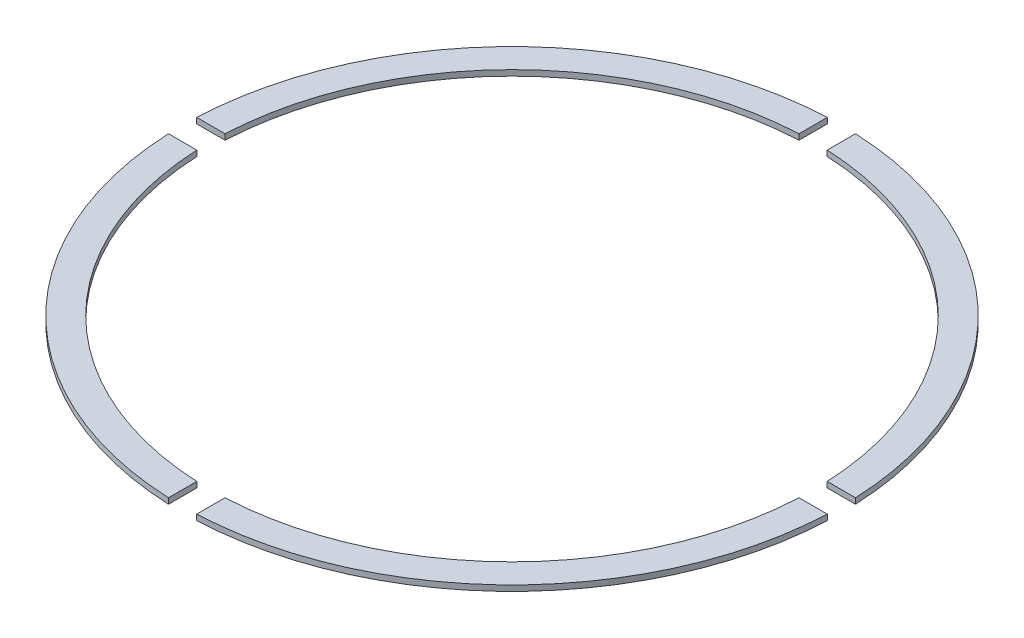
ISO-10303-21;
HEADER;
FILE_DESCRIPTION(('STEP AP214'),'2;1');
FILE_NAME('part.step','',(''),(''),'','','');
FILE_SCHEMA(('AUTOMOTIVE_DESIGN { 1 0 10303 214 1 1 1 1 }'));
ENDSEC;
DATA;
#1=APPLICATION_CONTEXT('core data for automotive mechanical design processes');
#2=APPLICATION_PROTOCOL_DEFINITION('international standard','automotive_design',2000,#1);
#3=PRODUCT_CONTEXT('',#1,'mechanical');
#4=PRODUCT('Part','Part','',(#3));
#5=PRODUCT_RELATED_PRODUCT_CATEGORY('part','',(#4));
#6=PRODUCT_DEFINITION_FORMATION('','',#4);
#7=PRODUCT_DEFINITION_CONTEXT('part definition',#1,'design');
#8=PRODUCT_DEFINITION('design','',#6,#7);
#9=PRODUCT_DEFINITION_SHAPE('','',#8);
#10=(LENGTH_UNIT() NAMED_UNIT(*) SI_UNIT(.MILLI.,.METRE.));
#11=(NAMED_UNIT(*) PLANE_ANGLE_UNIT() SI_UNIT($,.RADIAN.));
#12=(NAMED_UNIT(*) SI_UNIT($,.STERADIAN.) SOLID_ANGLE_UNIT());
#13=UNCERTAINTY_MEASURE_WITH_UNIT(LENGTH_MEASURE(1.E-05),#10,'distance_accuracy_value','');
#14=(GEOMETRIC_REPRESENTATION_CONTEXT(3) GLOBAL_UNCERTAINTY_ASSIGNED_CONTEXT((#13)) GLOBAL_UNIT_ASSIGNED_CONTEXT((#10,
#11,#12)) REPRESENTATION_CONTEXT('',''));
#15=CARTESIAN_POINT('',(0.,0.,0.));
#16=DIRECTION('',(0.,0.,1.));
#17=DIRECTION('',(1.,0.,0.));
#18=AXIS2_PLACEMENT_3D('',#15,#16,#17);
#19=CARTESIAN_POINT('',(0.,1.5,0.));
#20=DIRECTION('',(0.,1.,0.));
#21=DIRECTION('',(0.,0.,1.));
#22=AXIS2_PLACEMENT_3D('',#19,#20,#21);
#23=PLANE('',#22);
#24=DIRECTION('',(0.,0.,-1.));
#25=VECTOR('',#24,1.);
#26=CARTESIAN_POINT('',(7.49999999999936,1.5,-183.804563233899));
#27=LINE('',#26,#25);
#28=CARTESIAN_POINT('',(7.49999999999944,1.5,-159.824122084246));
#29=VERTEX_POINT('',#28);
#30=CARTESIAN_POINT('',(7.49999999999939,1.5,-174.839211849059));
#31=VERTEX_POINT('',#30);
#32=EDGE_CURVE('E12',#29,#31,#27,.T.);
#33=ORIENTED_EDGE('',*,*,#32,.F.);
#34=CARTESIAN_POINT('',(0.,1.5,0.));
#35=DIRECTION('',(0.,1.,0.));
#36=DIRECTION('',(0.,0.,1.));
#37=AXIS2_PLACEMENT_3D('',#34,#35,#36);
#38=CIRCLE('',#37,160.);
#39=CARTESIAN_POINT('',(159.824122084246,1.5,-7.5));
#40=VERTEX_POINT('',#39);
#41=EDGE_CURVE('E48',#40,#29,#38,.T.);
#42=ORIENTED_EDGE('',*,*,#41,.F.);
#43=DIRECTION('',(-1.,0.,0.));
#44=VECTOR('',#43,1.);
#45=CARTESIAN_POINT('',(183.804563233898,1.5,-7.5));
#46=LINE('',#45,#44);
#47=CARTESIAN_POINT('',(174.839211849059,1.5,-7.5));
#48=VERTEX_POINT('',#47);
#49=EDGE_CURVE('E97',#48,#40,#46,.T.);
#50=ORIENTED_EDGE('',*,*,#49,.F.);
#51=CARTESIAN_POINT('',(0.,1.5,0.));
#52=DIRECTION('',(0.,1.,0.));
#53=DIRECTION('',(0.,0.,1.));
#54=AXIS2_PLACEMENT_3D('',#51,#52,#53);
#55=CIRCLE('',#54,175.);
#56=EDGE_CURVE('E94',#48,#31,#55,.T.);
#57=ORIENTED_EDGE('',*,*,#56,.T.);
#58=EDGE_LOOP('',(#33,#42,#50,#57));
#59=FACE_BOUND('',#58,.T.);
#60=ADVANCED_FACE('F45',(#59),#23,.T.);
#61=CARTESIAN_POINT('',(0.,-1.5,0.));
#62=DIRECTION('',(0.,1.,0.));
#63=DIRECTION('',(0.,0.,1.));
#64=AXIS2_PLACEMENT_3D('',#61,#62,#63);
#65=PLANE('',#64);
#66=CARTESIAN_POINT('',(0.,-1.5,0.));
#67=DIRECTION('',(0.,1.,0.));
#68=DIRECTION('',(0.,0.,1.));
#69=AXIS2_PLACEMENT_3D('',#66,#67,#68);
#70=CIRCLE('',#69,160.);
#71=CARTESIAN_POINT('',(159.824122084246,-1.5,-7.5));
#72=VERTEX_POINT('',#71);
#73=CARTESIAN_POINT('',(7.49999999999944,-1.5,-159.824122084246));
#74=VERTEX_POINT('',#73);
#75=EDGE_CURVE('E112',#72,#74,#70,.T.);
#76=ORIENTED_EDGE('',*,*,#75,.T.);
#77=DIRECTION('',(0.,0.,-1.));
#78=VECTOR('',#77,1.);
#79=CARTESIAN_POINT('',(7.49999999999936,-1.5,-183.804563233899));
#80=LINE('',#79,#78);
#81=CARTESIAN_POINT('',(7.49999999999939,-1.5,-174.839211849059));
#82=VERTEX_POINT('',#81);
#83=EDGE_CURVE('E79',#74,#82,#80,.T.);
#84=ORIENTED_EDGE('',*,*,#83,.T.);
#85=CARTESIAN_POINT('',(0.,-1.5,0.));
#86=DIRECTION('',(0.,1.,0.));
#87=DIRECTION('',(0.,0.,1.));
#88=AXIS2_PLACEMENT_3D('',#85,#86,#87);
#89=CIRCLE('',#88,175.);
#90=CARTESIAN_POINT('',(174.839211849059,-1.5,-7.5));
#91=VERTEX_POINT('',#90);
#92=EDGE_CURVE('E105',#91,#82,#89,.T.);
#93=ORIENTED_EDGE('',*,*,#92,.F.);
#94=DIRECTION('',(-1.,0.,0.));
#95=VECTOR('',#94,1.);
#96=CARTESIAN_POINT('',(183.804563233898,-1.5,-7.5));
#97=LINE('',#96,#95);
#98=EDGE_CURVE('E109',#91,#72,#97,.T.);
#99=ORIENTED_EDGE('',*,*,#98,.T.);
#100=EDGE_LOOP('',(#76,#84,#93,#99));
#101=FACE_BOUND('',#100,.T.);
#102=ADVANCED_FACE('F117',(#101),#65,.F.);
#103=CARTESIAN_POINT('',(0.,1.5,0.));
#104=DIRECTION('',(0.,-1.,0.));
#105=DIRECTION('',(0.,0.,-1.));
#106=AXIS2_PLACEMENT_3D('',#103,#104,#105);
#107=CYLINDRICAL_SURFACE('',#106,175.);
#108=ORIENTED_EDGE('',*,*,#92,.T.);
#109=DIRECTION('',(0.,-1.,0.));
#110=VECTOR('',#109,1.);
#111=CARTESIAN_POINT('',(7.49999999999939,1.5,-174.839211849059));
#112=LINE('',#111,#110);
#113=EDGE_CURVE('E62',#82,#31,#112,.F.);
#114=ORIENTED_EDGE('',*,*,#113,.T.);
#115=ORIENTED_EDGE('',*,*,#56,.F.);
#116=DIRECTION('',(0.,-1.,0.));
#117=VECTOR('',#116,1.);
#118=CARTESIAN_POINT('',(174.839211849059,1.5,-7.5));
#119=LINE('',#118,#117);
#120=EDGE_CURVE('E98',#48,#91,#119,.T.);
#121=ORIENTED_EDGE('',*,*,#120,.T.);
#122=EDGE_LOOP('',(#108,#114,#115,#121));
#123=FACE_BOUND('',#122,.T.);
#124=ADVANCED_FACE('F115',(#123),#107,.T.);
#125=CARTESIAN_POINT('',(0.,1.5,0.));
#126=DIRECTION('',(0.,-1.,0.));
#127=DIRECTION('',(0.,0.,-1.));
#128=AXIS2_PLACEMENT_3D('',#125,#126,#127);
#129=CYLINDRICAL_SURFACE('',#128,160.);
#130=DIRECTION('',(0.,-1.,0.));
#131=VECTOR('',#130,1.);
#132=CARTESIAN_POINT('',(7.49999999999944,1.5,-159.824122084246));
#133=LINE('',#132,#131);
#134=EDGE_CURVE('E54',#74,#29,#133,.F.);
#135=ORIENTED_EDGE('',*,*,#134,.F.);
#136=ORIENTED_EDGE('',*,*,#75,.F.);
#137=DIRECTION('',(0.,-1.,0.));
#138=VECTOR('',#137,1.);
#139=CARTESIAN_POINT('',(159.824122084246,1.5,-7.5));
#140=LINE('',#139,#138);
#141=EDGE_CURVE('E87',#40,#72,#140,.T.);
#142=ORIENTED_EDGE('',*,*,#141,.F.);
#143=ORIENTED_EDGE('',*,*,#41,.T.);
#144=EDGE_LOOP('',(#135,#136,#142,#143));
#145=FACE_BOUND('',#144,.T.);
#146=ADVANCED_FACE('F96',(#145),#129,.F.);
#147=CARTESIAN_POINT('',(183.804563233898,-1.5,-7.5));
#148=DIRECTION('',(0.,0.,-1.));
#149=DIRECTION('',(-1.,0.,0.));
#150=AXIS2_PLACEMENT_3D('',#147,#148,#149);
#151=PLANE('',#150);
#152=ORIENTED_EDGE('',*,*,#49,.T.);
#153=ORIENTED_EDGE('',*,*,#141,.T.);
#154=ORIENTED_EDGE('',*,*,#98,.F.);
#155=ORIENTED_EDGE('',*,*,#120,.F.);
#156=EDGE_LOOP('',(#152,#153,#154,#155));
#157=FACE_BOUND('',#156,.T.);
#158=ADVANCED_FACE('F119',(#157),#151,.F.);
#159=CARTESIAN_POINT('',(7.49999999999936,-1.5,-183.804563233899));
#160=DIRECTION('',(1.,0.,0.));
#161=DIRECTION('',(0.,0.,-1.));
#162=AXIS2_PLACEMENT_3D('',#159,#160,#161);
#163=PLANE('',#162);
#164=ORIENTED_EDGE('',*,*,#83,.F.);
#165=ORIENTED_EDGE('',*,*,#134,.T.);
#166=ORIENTED_EDGE('',*,*,#32,.T.);
#167=ORIENTED_EDGE('',*,*,#113,.F.);
#168=EDGE_LOOP('',(#164,#165,#166,#167));
#169=FACE_BOUND('',#168,.T.);
#170=ADVANCED_FACE('F82',(#169),#163,.F.);
#171=CLOSED_SHELL('',(#60,#102,#124,#146,#158,#170));
#172=MANIFOLD_SOLID_BREP('B2',#171);
#173=CARTESIAN_POINT('',(0.,1.5,0.));
#174=DIRECTION('',(0.,-1.,0.));
#175=DIRECTION('',(0.,0.,-1.));
#176=AXIS2_PLACEMENT_3D('',#173,#174,#175);
#177=CYLINDRICAL_SURFACE('',#176,160.);
#178=DIRECTION('',(0.,-1.,0.));
#179=VECTOR('',#178,1.);
#180=CARTESIAN_POINT('',(-159.824122084246,1.5,7.5));
#181=LINE('',#180,#179);
#182=CARTESIAN_POINT('',(-159.824122084246,1.5,7.5));
#183=VERTEX_POINT('',#182);
#184=CARTESIAN_POINT('',(-159.824122084246,-1.5,7.5));
#185=VERTEX_POINT('',#184);
#186=EDGE_CURVE('E43',#183,#185,#181,.T.);
#187=ORIENTED_EDGE('',*,*,#186,.F.);
#188=CARTESIAN_POINT('',(0.,1.5,0.));
#189=DIRECTION('',(0.,1.,0.));
#190=DIRECTION('',(0.,0.,1.));
#191=AXIS2_PLACEMENT_3D('',#188,#189,#190);
#192=CIRCLE('',#191,160.);
#193=CARTESIAN_POINT('',(-7.49999999999833,1.5,159.824122084246));
#194=VERTEX_POINT('',#193);
#195=EDGE_CURVE('E182',#183,#194,#192,.T.);
#196=ORIENTED_EDGE('',*,*,#195,.T.);
#197=DIRECTION('',(0.,-1.,0.));
#198=VECTOR('',#197,1.);
#199=CARTESIAN_POINT('',(-7.49999999999833,1.5,159.824122084246));
#200=LINE('',#199,#198);
#201=CARTESIAN_POINT('',(-7.49999999999833,-1.5,159.824122084246));
#202=VERTEX_POINT('',#201);
#203=EDGE_CURVE('E216',#202,#194,#200,.F.);
#204=ORIENTED_EDGE('',*,*,#203,.F.);
#205=CARTESIAN_POINT('',(0.,-1.5,0.));
#206=DIRECTION('',(0.,1.,0.));
#207=DIRECTION('',(0.,0.,1.));
#208=AXIS2_PLACEMENT_3D('',#205,#206,#207);
#209=CIRCLE('',#208,160.);
#210=EDGE_CURVE('E233',#185,#202,#209,.T.);
#211=ORIENTED_EDGE('',*,*,#210,.F.);
#212=EDGE_LOOP('',(#187,#196,#204,#211));
#213=FACE_BOUND('',#212,.T.);
#214=ADVANCED_FACE('F178',(#213),#177,.F.);
#215=CARTESIAN_POINT('',(0.,1.5,0.));
#216=DIRECTION('',(0.,-1.,0.));
#217=DIRECTION('',(0.,0.,-1.));
#218=AXIS2_PLACEMENT_3D('',#215,#216,#217);
#219=CYLINDRICAL_SURFACE('',#218,175.);
#220=CARTESIAN_POINT('',(0.,1.5,0.));
#221=DIRECTION('',(0.,1.,0.));
#222=DIRECTION('',(0.,0.,1.));
#223=AXIS2_PLACEMENT_3D('',#220,#221,#222);
#224=CIRCLE('',#223,175.);
#225=CARTESIAN_POINT('',(-174.839211849059,1.5,7.5));
#226=VERTEX_POINT('',#225);
#227=CARTESIAN_POINT('',(-7.49999999999817,1.5,174.839211849059));
#228=VERTEX_POINT('',#227);
#229=EDGE_CURVE('E239',#226,#228,#224,.T.);
#230=ORIENTED_EDGE('',*,*,#229,.F.);
#231=DIRECTION('',(0.,-1.,0.));
#232=VECTOR('',#231,1.);
#233=CARTESIAN_POINT('',(-174.839211849059,1.5,7.5));
#234=LINE('',#233,#232);
#235=CARTESIAN_POINT('',(-174.839211849059,-1.5,7.5));
#236=VERTEX_POINT('',#235);
#237=EDGE_CURVE('E197',#226,#236,#234,.T.);
#238=ORIENTED_EDGE('',*,*,#237,.T.);
#239=CARTESIAN_POINT('',(0.,-1.5,0.));
#240=DIRECTION('',(0.,1.,0.));
#241=DIRECTION('',(0.,0.,1.));
#242=AXIS2_PLACEMENT_3D('',#239,#240,#241);
#243=CIRCLE('',#242,175.);
#244=CARTESIAN_POINT('',(-7.49999999999817,-1.5,174.839211849059));
#245=VERTEX_POINT('',#244);
#246=EDGE_CURVE('E235',#236,#245,#243,.T.);
#247=ORIENTED_EDGE('',*,*,#246,.T.);
#248=DIRECTION('',(0.,-1.,0.));
#249=VECTOR('',#248,1.);
#250=CARTESIAN_POINT('',(-7.49999999999817,1.5,174.839211849059));
#251=LINE('',#250,#249);
#252=EDGE_CURVE('E236',#245,#228,#251,.F.);
#253=ORIENTED_EDGE('',*,*,#252,.T.);
#254=EDGE_LOOP('',(#230,#238,#247,#253));
#255=FACE_BOUND('',#254,.T.);
#256=ADVANCED_FACE('F251',(#255),#219,.T.);
#257=CARTESIAN_POINT('',(0.,-1.5,0.));
#258=DIRECTION('',(0.,1.,0.));
#259=DIRECTION('',(0.,0.,1.));
#260=AXIS2_PLACEMENT_3D('',#257,#258,#259);
#261=PLANE('',#260);
#262=ORIENTED_EDGE('',*,*,#246,.F.);
#263=DIRECTION('',(1.,0.,0.));
#264=VECTOR('',#263,1.);
#265=CARTESIAN_POINT('',(-183.804563233898,-1.5,7.5));
#266=LINE('',#265,#264);
#267=EDGE_CURVE('E224',#236,#185,#266,.T.);
#268=ORIENTED_EDGE('',*,*,#267,.T.);
#269=ORIENTED_EDGE('',*,*,#210,.T.);
#270=DIRECTION('',(0.,0.,1.));
#271=VECTOR('',#270,1.);
#272=CARTESIAN_POINT('',(-7.49999999999807,-1.5,183.804563233899));
#273=LINE('',#272,#271);
#274=EDGE_CURVE('E219',#202,#245,#273,.T.);
#275=ORIENTED_EDGE('',*,*,#274,.T.);
#276=EDGE_LOOP('',(#262,#268,#269,#275));
#277=FACE_BOUND('',#276,.T.);
#278=ADVANCED_FACE('F232',(#277),#261,.F.);
#279=CARTESIAN_POINT('',(0.,1.5,0.));
#280=DIRECTION('',(0.,1.,0.));
#281=DIRECTION('',(0.,0.,1.));
#282=AXIS2_PLACEMENT_3D('',#279,#280,#281);
#283=PLANE('',#282);
#284=DIRECTION('',(1.,0.,0.));
#285=VECTOR('',#284,1.);
#286=CARTESIAN_POINT('',(-183.804563233898,1.5,7.5));
#287=LINE('',#286,#285);
#288=EDGE_CURVE('E188',#226,#183,#287,.T.);
#289=ORIENTED_EDGE('',*,*,#288,.F.);
#290=ORIENTED_EDGE('',*,*,#229,.T.);
#291=DIRECTION('',(0.,0.,1.));
#292=VECTOR('',#291,1.);
#293=CARTESIAN_POINT('',(-7.49999999999807,1.5,183.804563233899));
#294=LINE('',#293,#292);
#295=EDGE_CURVE('E211',#194,#228,#294,.T.);
#296=ORIENTED_EDGE('',*,*,#295,.F.);
#297=ORIENTED_EDGE('',*,*,#195,.F.);
#298=EDGE_LOOP('',(#289,#290,#296,#297));
#299=FACE_BOUND('',#298,.T.);
#300=ADVANCED_FACE('F180',(#299),#283,.T.);
#301=CARTESIAN_POINT('',(-7.49999999999807,-1.5,183.804563233899));
#302=DIRECTION('',(-1.,0.,0.));
#303=DIRECTION('',(0.,0.,1.));
#304=AXIS2_PLACEMENT_3D('',#301,#302,#303);
#305=PLANE('',#304);
#306=ORIENTED_EDGE('',*,*,#274,.F.);
#307=ORIENTED_EDGE('',*,*,#203,.T.);
#308=ORIENTED_EDGE('',*,*,#295,.T.);
#309=ORIENTED_EDGE('',*,*,#252,.F.);
#310=EDGE_LOOP('',(#306,#307,#308,#309));
#311=FACE_BOUND('',#310,.T.);
#312=ADVANCED_FACE('F252',(#311),#305,.F.);
#313=CARTESIAN_POINT('',(-183.804563233898,-1.5,7.5));
#314=DIRECTION('',(0.,0.,1.));
#315=DIRECTION('',(1.,0.,0.));
#316=AXIS2_PLACEMENT_3D('',#313,#314,#315);
#317=PLANE('',#316);
#318=ORIENTED_EDGE('',*,*,#288,.T.);
#319=ORIENTED_EDGE('',*,*,#186,.T.);
#320=ORIENTED_EDGE('',*,*,#267,.F.);
#321=ORIENTED_EDGE('',*,*,#237,.F.);
#322=EDGE_LOOP('',(#318,#319,#320,#321));
#323=FACE_BOUND('',#322,.T.);
#324=ADVANCED_FACE('F223',(#323),#317,.F.);
#325=CLOSED_SHELL('',(#214,#256,#278,#300,#312,#324));
#326=MANIFOLD_SOLID_BREP('B6',#325);
#327=CARTESIAN_POINT('',(183.804563233898,-1.5,7.5));
#328=DIRECTION('',(0.,0.,1.));
#329=DIRECTION('',(1.,0.,0.));
#330=AXIS2_PLACEMENT_3D('',#327,#328,#329);
#331=PLANE('',#330);
#332=DIRECTION('',(1.,0.,0.));
#333=VECTOR('',#332,1.);
#334=CARTESIAN_POINT('',(183.804563233898,-1.5,7.5));
#335=LINE('',#334,#333);
#336=CARTESIAN_POINT('',(159.824122084246,-1.5,7.5));
#337=VERTEX_POINT('',#336);
#338=CARTESIAN_POINT('',(174.839211849059,-1.5,7.5));
#339=VERTEX_POINT('',#338);
#340=EDGE_CURVE('E372',#337,#339,#335,.T.);
#341=ORIENTED_EDGE('',*,*,#340,.F.);
#342=DIRECTION('',(0.,-1.,0.));
#343=VECTOR('',#342,1.);
#344=CARTESIAN_POINT('',(159.824122084246,1.5,7.5));
#345=LINE('',#344,#343);
#346=CARTESIAN_POINT('',(159.824122084246,1.5,7.5));
#347=VERTEX_POINT('',#346);
#348=EDGE_CURVE('E365',#337,#347,#345,.F.);
#349=ORIENTED_EDGE('',*,*,#348,.T.);
#350=DIRECTION('',(1.,0.,0.));
#351=VECTOR('',#350,1.);
#352=CARTESIAN_POINT('',(183.804563233898,1.5,7.5));
#353=LINE('',#352,#351);
#354=CARTESIAN_POINT('',(174.839211849059,1.5,7.5));
#355=VERTEX_POINT('',#354);
#356=EDGE_CURVE('E362',#347,#355,#353,.T.);
#357=ORIENTED_EDGE('',*,*,#356,.T.);
#358=DIRECTION('',(0.,-1.,0.));
#359=VECTOR('',#358,1.);
#360=CARTESIAN_POINT('',(174.839211849059,1.5,7.5));
#361=LINE('',#360,#359);
#362=EDGE_CURVE('E375',#339,#355,#361,.F.);
#363=ORIENTED_EDGE('',*,*,#362,.F.);
#364=EDGE_LOOP('',(#341,#349,#357,#363));
#365=FACE_BOUND('',#364,.T.);
#366=ADVANCED_FACE('F310',(#365),#331,.F.);
#367=CARTESIAN_POINT('',(0.,1.5,0.));
#368=DIRECTION('',(0.,-1.,0.));
#369=DIRECTION('',(0.,0.,-1.));
#370=AXIS2_PLACEMENT_3D('',#367,#368,#369);
#371=CYLINDRICAL_SURFACE('',#370,160.);
#372=DIRECTION('',(0.,-1.,0.));
#373=VECTOR('',#372,1.);
#374=CARTESIAN_POINT('',(7.50000000000167,1.5,159.824122084246));
#375=LINE('',#374,#373);
#376=CARTESIAN_POINT('',(7.50000000000167,1.5,159.824122084246));
#377=VERTEX_POINT('',#376);
#378=CARTESIAN_POINT('',(7.50000000000167,-1.5,159.824122084246));
#379=VERTEX_POINT('',#378);
#380=EDGE_CURVE('E176',#377,#379,#375,.T.);
#381=ORIENTED_EDGE('',*,*,#380,.F.);
#382=CARTESIAN_POINT('',(0.,1.5,0.));
#383=DIRECTION('',(0.,1.,0.));
#384=DIRECTION('',(0.,0.,1.));
#385=AXIS2_PLACEMENT_3D('',#382,#383,#384);
#386=CIRCLE('',#385,160.);
#387=EDGE_CURVE('E314',#377,#347,#386,.T.);
#388=ORIENTED_EDGE('',*,*,#387,.T.);
#389=ORIENTED_EDGE('',*,*,#348,.F.);
#390=CARTESIAN_POINT('',(0.,-1.5,0.));
#391=DIRECTION('',(0.,1.,0.));
#392=DIRECTION('',(0.,0.,1.));
#393=AXIS2_PLACEMENT_3D('',#390,#391,#392);
#394=CIRCLE('',#393,160.);
#395=EDGE_CURVE('E359',#379,#337,#394,.T.);
#396=ORIENTED_EDGE('',*,*,#395,.F.);
#397=EDGE_LOOP('',(#381,#388,#389,#396));
#398=FACE_BOUND('',#397,.T.);
#399=ADVANCED_FACE('F356',(#398),#371,.F.);
#400=CARTESIAN_POINT('',(0.,1.5,0.));
#401=DIRECTION('',(0.,-1.,0.));
#402=DIRECTION('',(0.,0.,-1.));
#403=AXIS2_PLACEMENT_3D('',#400,#401,#402);
#404=CYLINDRICAL_SURFACE('',#403,175.);
#405=CARTESIAN_POINT('',(0.,1.5,0.));
#406=DIRECTION('',(0.,1.,0.));
#407=DIRECTION('',(0.,0.,1.));
#408=AXIS2_PLACEMENT_3D('',#405,#406,#407);
#409=CIRCLE('',#408,175.);
#410=CARTESIAN_POINT('',(7.50000000000183,1.5,174.839211849059));
#411=VERTEX_POINT('',#410);
#412=EDGE_CURVE('E352',#411,#355,#409,.T.);
#413=ORIENTED_EDGE('',*,*,#412,.F.);
#414=DIRECTION('',(0.,-1.,0.));
#415=VECTOR('',#414,1.);
#416=CARTESIAN_POINT('',(7.50000000000183,1.5,174.839211849059));
#417=LINE('',#416,#415);
#418=CARTESIAN_POINT('',(7.50000000000183,-1.5,174.839211849059));
#419=VERTEX_POINT('',#418);
#420=EDGE_CURVE('E327',#411,#419,#417,.T.);
#421=ORIENTED_EDGE('',*,*,#420,.T.);
#422=CARTESIAN_POINT('',(0.,-1.5,0.));
#423=DIRECTION('',(0.,1.,0.));
#424=DIRECTION('',(0.,0.,1.));
#425=AXIS2_PLACEMENT_3D('',#422,#423,#424);
#426=CIRCLE('',#425,175.);
#427=EDGE_CURVE('E363',#419,#339,#426,.T.);
#428=ORIENTED_EDGE('',*,*,#427,.T.);
#429=ORIENTED_EDGE('',*,*,#362,.T.);
#430=EDGE_LOOP('',(#413,#421,#428,#429));
#431=FACE_BOUND('',#430,.T.);
#432=ADVANCED_FACE('F380',(#431),#404,.T.);
#433=CARTESIAN_POINT('',(0.,-1.5,0.));
#434=DIRECTION('',(0.,1.,0.));
#435=DIRECTION('',(0.,0.,1.));
#436=AXIS2_PLACEMENT_3D('',#433,#434,#435);
#437=PLANE('',#436);
#438=ORIENTED_EDGE('',*,*,#427,.F.);
#439=DIRECTION('',(0.,0.,-1.));
#440=VECTOR('',#439,1.);
#441=CARTESIAN_POINT('',(7.50000000000193,-1.5,183.804563233898));
#442=LINE('',#441,#440);
#443=EDGE_CURVE('E331',#419,#379,#442,.T.);
#444=ORIENTED_EDGE('',*,*,#443,.T.);
#445=ORIENTED_EDGE('',*,*,#395,.T.);
#446=ORIENTED_EDGE('',*,*,#340,.T.);
#447=EDGE_LOOP('',(#438,#444,#445,#446));
#448=FACE_BOUND('',#447,.T.);
#449=ADVANCED_FACE('F384',(#448),#437,.F.);
#450=CARTESIAN_POINT('',(0.,1.5,0.));
#451=DIRECTION('',(0.,1.,0.));
#452=DIRECTION('',(0.,0.,1.));
#453=AXIS2_PLACEMENT_3D('',#450,#451,#452);
#454=PLANE('',#453);
#455=DIRECTION('',(0.,0.,-1.));
#456=VECTOR('',#455,1.);
#457=CARTESIAN_POINT('',(7.50000000000193,1.5,183.804563233898));
#458=LINE('',#457,#456);
#459=EDGE_CURVE('E319',#411,#377,#458,.T.);
#460=ORIENTED_EDGE('',*,*,#459,.F.);
#461=ORIENTED_EDGE('',*,*,#412,.T.);
#462=ORIENTED_EDGE('',*,*,#356,.F.);
#463=ORIENTED_EDGE('',*,*,#387,.F.);
#464=EDGE_LOOP('',(#460,#461,#462,#463));
#465=FACE_BOUND('',#464,.T.);
#466=ADVANCED_FACE('F312',(#465),#454,.T.);
#467=CARTESIAN_POINT('',(7.50000000000193,-1.5,183.804563233898));
#468=DIRECTION('',(1.,0.,0.));
#469=DIRECTION('',(0.,0.,-1.));
#470=AXIS2_PLACEMENT_3D('',#467,#468,#469);
#471=PLANE('',#470);
#472=ORIENTED_EDGE('',*,*,#459,.T.);
#473=ORIENTED_EDGE('',*,*,#380,.T.);
#474=ORIENTED_EDGE('',*,*,#443,.F.);
#475=ORIENTED_EDGE('',*,*,#420,.F.);
#476=EDGE_LOOP('',(#472,#473,#474,#475));
#477=FACE_BOUND('',#476,.T.);
#478=ADVANCED_FACE('F348',(#477),#471,.F.);
#479=CLOSED_SHELL('',(#366,#399,#432,#449,#466,#478));
#480=MANIFOLD_SOLID_BREP('B37',#479);
#481=CARTESIAN_POINT('',(0.,1.5,0.));
#482=DIRECTION('',(0.,-1.,0.));
#483=DIRECTION('',(0.,0.,-1.));
#484=AXIS2_PLACEMENT_3D('',#481,#482,#483);
#485=CYLINDRICAL_SURFACE('',#484,160.);
#486=DIRECTION('',(0.,-1.,0.));
#487=VECTOR('',#486,1.);
#488=CARTESIAN_POINT('',(-7.50000000000056,1.5,-159.824122084246));
#489=LINE('',#488,#487);
#490=CARTESIAN_POINT('',(-7.50000000000056,1.5,-159.824122084246));
#491=VERTEX_POINT('',#490);
#492=CARTESIAN_POINT('',(-7.50000000000056,-1.5,-159.824122084246));
#493=VERTEX_POINT('',#492);
#494=EDGE_CURVE('E308',#491,#493,#489,.T.);
#495=ORIENTED_EDGE('',*,*,#494,.F.);
#496=CARTESIAN_POINT('',(0.,1.5,0.));
#497=DIRECTION('',(0.,1.,0.));
#498=DIRECTION('',(0.,0.,1.));
#499=AXIS2_PLACEMENT_3D('',#496,#497,#498);
#500=CIRCLE('',#499,160.);
#501=CARTESIAN_POINT('',(-159.824122084246,1.5,-7.5));
#502=VERTEX_POINT('',#501);
#503=EDGE_CURVE('E483',#491,#502,#500,.T.);
#504=ORIENTED_EDGE('',*,*,#503,.T.);
#505=DIRECTION('',(0.,-1.,0.));
#506=VECTOR('',#505,1.);
#507=CARTESIAN_POINT('',(-159.824122084246,1.5,-7.5));
#508=LINE('',#507,#506);
#509=CARTESIAN_POINT('',(-159.824122084246,-1.5,-7.5));
#510=VERTEX_POINT('',#509);
#511=EDGE_CURVE('E441',#510,#502,#508,.F.);
#512=ORIENTED_EDGE('',*,*,#511,.F.);
#513=CARTESIAN_POINT('',(0.,-1.5,0.));
#514=DIRECTION('',(0.,1.,0.));
#515=DIRECTION('',(0.,0.,1.));
#516=AXIS2_PLACEMENT_3D('',#513,#514,#515);
#517=CIRCLE('',#516,160.);
#518=EDGE_CURVE('E487',#493,#510,#517,.T.);
#519=ORIENTED_EDGE('',*,*,#518,.F.);
#520=EDGE_LOOP('',(#495,#504,#512,#519));
#521=FACE_BOUND('',#520,.T.);
#522=ADVANCED_FACE('F433',(#521),#485,.F.);
#523=CARTESIAN_POINT('',(0.,1.5,0.));
#524=DIRECTION('',(0.,-1.,0.));
#525=DIRECTION('',(0.,0.,-1.));
#526=AXIS2_PLACEMENT_3D('',#523,#524,#525);
#527=CYLINDRICAL_SURFACE('',#526,175.);
#528=CARTESIAN_POINT('',(0.,1.5,0.));
#529=DIRECTION('',(0.,1.,0.));
#530=DIRECTION('',(0.,0.,1.));
#531=AXIS2_PLACEMENT_3D('',#528,#529,#530);
#532=CIRCLE('',#531,175.);
#533=CARTESIAN_POINT('',(-7.50000000000061,1.5,-174.839211849059));
#534=VERTEX_POINT('',#533);
#535=CARTESIAN_POINT('',(-174.839211849059,1.5,-7.5));
#536=VERTEX_POINT('',#535);
#537=EDGE_CURVE('E478',#534,#536,#532,.T.);
#538=ORIENTED_EDGE('',*,*,#537,.F.);
#539=DIRECTION('',(0.,-1.,0.));
#540=VECTOR('',#539,1.);
#541=CARTESIAN_POINT('',(-7.50000000000061,1.5,-174.839211849059));
#542=LINE('',#541,#540);
#543=CARTESIAN_POINT('',(-7.50000000000061,-1.5,-174.839211849059));
#544=VERTEX_POINT('',#543);
#545=EDGE_CURVE('E491',#534,#544,#542,.T.);
#546=ORIENTED_EDGE('',*,*,#545,.T.);
#547=CARTESIAN_POINT('',(0.,-1.5,0.));
#548=DIRECTION('',(0.,1.,0.));
#549=DIRECTION('',(0.,0.,1.));
#550=AXIS2_PLACEMENT_3D('',#547,#548,#549);
#551=CIRCLE('',#550,175.);
#552=CARTESIAN_POINT('',(-174.839211849059,-1.5,-7.5));
#553=VERTEX_POINT('',#552);
#554=EDGE_CURVE('E486',#544,#553,#551,.T.);
#555=ORIENTED_EDGE('',*,*,#554,.T.);
#556=DIRECTION('',(0.,-1.,0.));
#557=VECTOR('',#556,1.);
#558=CARTESIAN_POINT('',(-174.839211849059,1.5,-7.5));
#559=LINE('',#558,#557);
#560=EDGE_CURVE('E497',#553,#536,#559,.F.);
#561=ORIENTED_EDGE('',*,*,#560,.T.);
#562=EDGE_LOOP('',(#538,#546,#555,#561));
#563=FACE_BOUND('',#562,.T.);
#564=ADVANCED_FACE('F435',(#563),#527,.T.);
#565=CARTESIAN_POINT('',(0.,-1.5,0.));
#566=DIRECTION('',(0.,1.,0.));
#567=DIRECTION('',(0.,0.,1.));
#568=AXIS2_PLACEMENT_3D('',#565,#566,#567);
#569=PLANE('',#568);
#570=ORIENTED_EDGE('',*,*,#554,.F.);
#571=DIRECTION('',(0.,0.,1.));
#572=VECTOR('',#571,1.);
#573=CARTESIAN_POINT('',(-7.50000000000064,-1.5,-183.804563233898));
#574=LINE('',#573,#572);
#575=EDGE_CURVE('E499',#544,#493,#574,.T.);
#576=ORIENTED_EDGE('',*,*,#575,.T.);
#577=ORIENTED_EDGE('',*,*,#518,.T.);
#578=DIRECTION('',(-1.,0.,0.));
#579=VECTOR('',#578,1.);
#580=CARTESIAN_POINT('',(-183.804563233898,-1.5,-7.5));
#581=LINE('',#580,#579);
#582=EDGE_CURVE('E448',#510,#553,#581,.T.);
#583=ORIENTED_EDGE('',*,*,#582,.T.);
#584=EDGE_LOOP('',(#570,#576,#577,#583));
#585=FACE_BOUND('',#584,.T.);
#586=ADVANCED_FACE('F505',(#585),#569,.F.);
#587=CARTESIAN_POINT('',(0.,1.5,0.));
#588=DIRECTION('',(0.,1.,0.));
#589=DIRECTION('',(0.,0.,1.));
#590=AXIS2_PLACEMENT_3D('',#587,#588,#589);
#591=PLANE('',#590);
#592=DIRECTION('',(0.,0.,1.));
#593=VECTOR('',#592,1.);
#594=CARTESIAN_POINT('',(-7.50000000000064,1.5,-183.804563233898));
#595=LINE('',#594,#593);
#596=EDGE_CURVE('E455',#534,#491,#595,.T.);
#597=ORIENTED_EDGE('',*,*,#596,.F.);
#598=ORIENTED_EDGE('',*,*,#537,.T.);
#599=DIRECTION('',(-1.,0.,0.));
#600=VECTOR('',#599,1.);
#601=CARTESIAN_POINT('',(-183.804563233898,1.5,-7.5));
#602=LINE('',#601,#600);
#603=EDGE_CURVE('E472',#502,#536,#602,.T.);
#604=ORIENTED_EDGE('',*,*,#603,.F.);
#605=ORIENTED_EDGE('',*,*,#503,.F.);
#606=EDGE_LOOP('',(#597,#598,#604,#605));
#607=FACE_BOUND('',#606,.T.);
#608=ADVANCED_FACE('F482',(#607),#591,.T.);
#609=CARTESIAN_POINT('',(-183.804563233898,-1.5,-7.5));
#610=DIRECTION('',(0.,0.,-1.));
#611=DIRECTION('',(-1.,0.,0.));
#612=AXIS2_PLACEMENT_3D('',#609,#610,#611);
#613=PLANE('',#612);
#614=ORIENTED_EDGE('',*,*,#582,.F.);
#615=ORIENTED_EDGE('',*,*,#511,.T.);
#616=ORIENTED_EDGE('',*,*,#603,.T.);
#617=ORIENTED_EDGE('',*,*,#560,.F.);
#618=EDGE_LOOP('',(#614,#615,#616,#617));
#619=FACE_BOUND('',#618,.T.);
#620=ADVANCED_FACE('F471',(#619),#613,.F.);
#621=CARTESIAN_POINT('',(-7.50000000000064,-1.5,-183.804563233898));
#622=DIRECTION('',(-1.,0.,0.));
#623=DIRECTION('',(0.,0.,1.));
#624=AXIS2_PLACEMENT_3D('',#621,#622,#623);
#625=PLANE('',#624);
#626=ORIENTED_EDGE('',*,*,#596,.T.);
#627=ORIENTED_EDGE('',*,*,#494,.T.);
#628=ORIENTED_EDGE('',*,*,#575,.F.);
#629=ORIENTED_EDGE('',*,*,#545,.F.);
#630=EDGE_LOOP('',(#626,#627,#628,#629));
#631=FACE_BOUND('',#630,.T.);
#632=ADVANCED_FACE('F506',(#631),#625,.F.);
#633=CLOSED_SHELL('',(#522,#564,#586,#608,#620,#632));
#634=MANIFOLD_SOLID_BREP('B170',#633);
#635=ADVANCED_BREP_SHAPE_REPRESENTATION('',(#18,#172,#326,#480,#634),#14);
#636=SHAPE_DEFINITION_REPRESENTATION(#9,#635);
ENDSEC;
END-ISO-10303-21;
